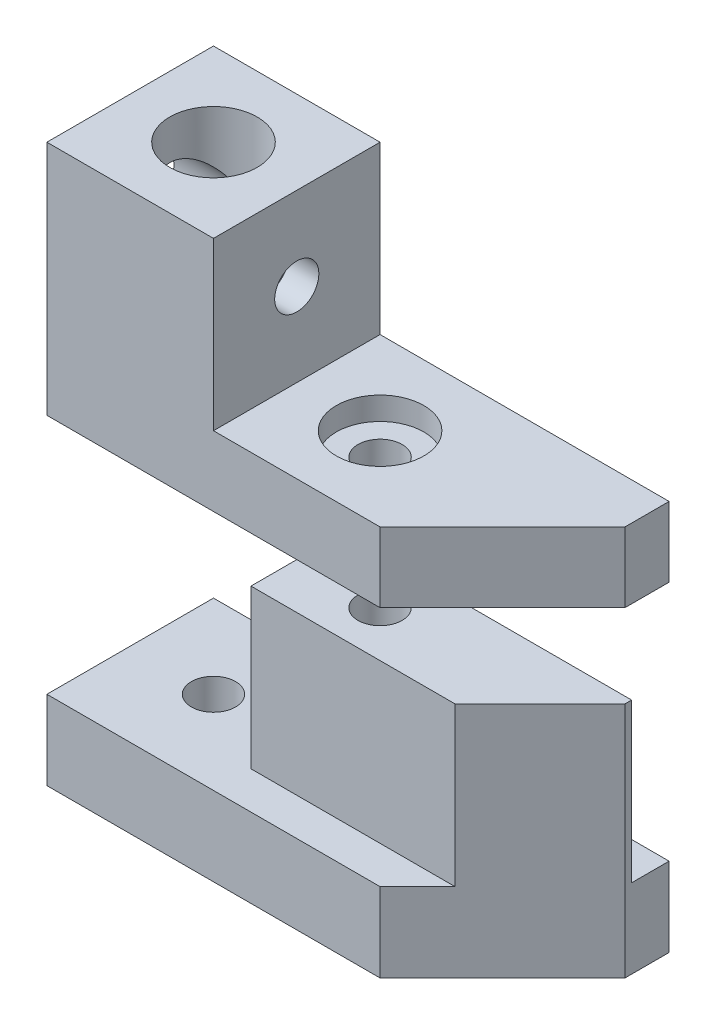
ISO-10303-21;
HEADER;
FILE_DESCRIPTION(('STEP AP214'),'2;1');
FILE_NAME('part.step','',(''),(''),'','','');
FILE_SCHEMA(('AUTOMOTIVE_DESIGN { 1 0 10303 214 1 1 1 1 }'));
ENDSEC;
DATA;
#1=APPLICATION_CONTEXT('core data for automotive mechanical design processes');
#2=APPLICATION_PROTOCOL_DEFINITION('international standard','automotive_design',2000,#1);
#3=PRODUCT_CONTEXT('',#1,'mechanical');
#4=PRODUCT('Part','Part','',(#3));
#5=PRODUCT_RELATED_PRODUCT_CATEGORY('part','',(#4));
#6=PRODUCT_DEFINITION_FORMATION('','',#4);
#7=PRODUCT_DEFINITION_CONTEXT('part definition',#1,'design');
#8=PRODUCT_DEFINITION('design','',#6,#7);
#9=PRODUCT_DEFINITION_SHAPE('','',#8);
#10=(LENGTH_UNIT() NAMED_UNIT(*) SI_UNIT(.MILLI.,.METRE.));
#11=(NAMED_UNIT(*) PLANE_ANGLE_UNIT() SI_UNIT($,.RADIAN.));
#12=(NAMED_UNIT(*) SI_UNIT($,.STERADIAN.) SOLID_ANGLE_UNIT());
#13=UNCERTAINTY_MEASURE_WITH_UNIT(LENGTH_MEASURE(1.E-05),#10,'distance_accuracy_value','');
#14=(GEOMETRIC_REPRESENTATION_CONTEXT(3) GLOBAL_UNCERTAINTY_ASSIGNED_CONTEXT((#13)) GLOBAL_UNIT_ASSIGNED_CONTEXT((#10,
#11,#12)) REPRESENTATION_CONTEXT('',''));
#15=CARTESIAN_POINT('',(0.,0.,0.));
#16=DIRECTION('',(0.,0.,1.));
#17=DIRECTION('',(1.,0.,0.));
#18=AXIS2_PLACEMENT_3D('',#15,#16,#17);
#19=CARTESIAN_POINT('',(-40.,46.9,-40.));
#20=DIRECTION('',(0.,1.,0.));
#21=DIRECTION('',(-1.,0.,0.));
#22=AXIS2_PLACEMENT_3D('',#19,#20,#21);
#23=CYLINDRICAL_SURFACE('',#22,5.25);
#24=CARTESIAN_POINT('',(-40.,66.9,-40.));
#25=DIRECTION('',(0.,-1.,0.));
#26=DIRECTION('',(-1.,0.,0.));
#27=AXIS2_PLACEMENT_3D('',#24,#25,#26);
#28=CIRCLE('',#27,5.25);
#29=CARTESIAN_POINT('',(-45.25,66.9,-40.));
#30=VERTEX_POINT('',#29);
#31=EDGE_CURVE('E274',#30,#30,#28,.T.);
#32=ORIENTED_EDGE('',*,*,#31,.F.);
#33=EDGE_LOOP('',(#32));
#34=FACE_BOUND('',#33,.T.);
#35=CARTESIAN_POINT('',(-40.,56.9,-40.));
#36=DIRECTION('',(-0.707106781186547,-0.707106781186547,0.));
#37=DIRECTION('',(-0.707106781186547,0.707106781186547,0.));
#38=AXIS2_PLACEMENT_3D('',#35,#36,#37);
#39=ELLIPSE('',#38,7.42462120245875,5.25);
#40=CARTESIAN_POINT('',(-40.,56.9,-45.25));
#41=VERTEX_POINT('',#40);
#42=CARTESIAN_POINT('',(-40.,56.9,-34.75));
#43=VERTEX_POINT('',#42);
#44=EDGE_CURVE('E12',#41,#43,#39,.F.);
#45=ORIENTED_EDGE('',*,*,#44,.F.);
#46=CARTESIAN_POINT('',(-40.,56.9,-40.));
#47=DIRECTION('',(0.707106781186547,-0.707106781186547,0.));
#48=DIRECTION('',(0.707106781186547,0.707106781186547,0.));
#49=AXIS2_PLACEMENT_3D('',#46,#47,#48);
#50=ELLIPSE('',#49,7.42462120245875,5.25);
#51=EDGE_CURVE('E68',#43,#41,#50,.F.);
#52=ORIENTED_EDGE('',*,*,#51,.F.);
#53=EDGE_LOOP('',(#45,#52));
#54=FACE_BOUND('',#53,.T.);
#55=ADVANCED_FACE('F59',(#34,#54),#23,.F.);
#56=CARTESIAN_POINT('',(-10.,46.9,-30.));
#57=DIRECTION('',(0.,0.,-1.));
#58=DIRECTION('',(1.,0.,0.));
#59=AXIS2_PLACEMENT_3D('',#56,#57,#58);
#60=PLANE('',#59);
#61=DIRECTION('',(-1.,0.,0.));
#62=VECTOR('',#61,1.);
#63=CARTESIAN_POINT('',(-10.,38.5,-30.));
#64=LINE('',#63,#62);
#65=CARTESIAN_POINT('',(-10.,38.5,-30.));
#66=VERTEX_POINT('',#65);
#67=CARTESIAN_POINT('',(-50.,38.5,-30.));
#68=VERTEX_POINT('',#67);
#69=EDGE_CURVE('E216',#66,#68,#64,.T.);
#70=ORIENTED_EDGE('',*,*,#69,.F.);
#71=DIRECTION('',(0.,-1.,0.));
#72=VECTOR('',#71,1.);
#73=CARTESIAN_POINT('',(-10.,46.9,-30.));
#74=LINE('',#73,#72);
#75=CARTESIAN_POINT('',(-10.,46.9,-30.));
#76=VERTEX_POINT('',#75);
#77=EDGE_CURVE('E241',#76,#66,#74,.T.);
#78=ORIENTED_EDGE('',*,*,#77,.F.);
#79=DIRECTION('',(-1.,0.,0.));
#80=VECTOR('',#79,1.);
#81=CARTESIAN_POINT('',(-10.,46.9,-30.));
#82=LINE('',#81,#80);
#83=CARTESIAN_POINT('',(-30.,46.9,-30.));
#84=VERTEX_POINT('',#83);
#85=EDGE_CURVE('E240',#76,#84,#82,.T.);
#86=ORIENTED_EDGE('',*,*,#85,.T.);
#87=DIRECTION('',(0.,-1.,0.));
#88=VECTOR('',#87,1.);
#89=CARTESIAN_POINT('',(-30.,66.9,-30.));
#90=LINE('',#89,#88);
#91=CARTESIAN_POINT('',(-30.,66.9,-30.));
#92=VERTEX_POINT('',#91);
#93=EDGE_CURVE('E230',#92,#84,#90,.T.);
#94=ORIENTED_EDGE('',*,*,#93,.F.);
#95=DIRECTION('',(-1.,0.,0.));
#96=VECTOR('',#95,1.);
#97=CARTESIAN_POINT('',(-30.,66.9,-30.));
#98=LINE('',#97,#96);
#99=CARTESIAN_POINT('',(-50.,66.9,-30.));
#100=VERTEX_POINT('',#99);
#101=EDGE_CURVE('E222',#92,#100,#98,.T.);
#102=ORIENTED_EDGE('',*,*,#101,.T.);
#103=DIRECTION('',(0.,-1.,0.));
#104=VECTOR('',#103,1.);
#105=CARTESIAN_POINT('',(-50.,46.9,-30.));
#106=LINE('',#105,#104);
#107=EDGE_CURVE('E131',#100,#68,#106,.T.);
#108=ORIENTED_EDGE('',*,*,#107,.T.);
#109=EDGE_LOOP('',(#70,#78,#86,#94,#102,#108));
#110=FACE_BOUND('',#109,.T.);
#111=ADVANCED_FACE('F61',(#110),#60,.F.);
#112=CARTESIAN_POINT('',(-50.,46.9,-30.));
#113=DIRECTION('',(1.,0.,0.));
#114=DIRECTION('',(0.,0.,1.));
#115=AXIS2_PLACEMENT_3D('',#112,#113,#114);
#116=PLANE('',#115);
#117=CARTESIAN_POINT('',(-50.,56.9,-40.));
#118=DIRECTION('',(1.,0.,0.));
#119=DIRECTION('',(0.,0.,-1.));
#120=AXIS2_PLACEMENT_3D('',#117,#118,#119);
#121=CIRCLE('',#120,5.25);
#122=CARTESIAN_POINT('',(-50.,56.9,-45.25));
#123=VERTEX_POINT('',#122);
#124=EDGE_CURVE('E202',#123,#123,#121,.T.);
#125=ORIENTED_EDGE('',*,*,#124,.T.);
#126=EDGE_LOOP('',(#125));
#127=FACE_BOUND('',#126,.T.);
#128=DIRECTION('',(0.,0.,-1.));
#129=VECTOR('',#128,1.);
#130=CARTESIAN_POINT('',(-50.,38.5,-30.));
#131=LINE('',#130,#129);
#132=CARTESIAN_POINT('',(-50.,38.5,-50.));
#133=VERTEX_POINT('',#132);
#134=EDGE_CURVE('E206',#68,#133,#131,.T.);
#135=ORIENTED_EDGE('',*,*,#134,.F.);
#136=ORIENTED_EDGE('',*,*,#107,.F.);
#137=DIRECTION('',(0.,0.,-1.));
#138=VECTOR('',#137,1.);
#139=CARTESIAN_POINT('',(-50.,66.9,-30.));
#140=LINE('',#139,#138);
#141=CARTESIAN_POINT('',(-50.,66.9,-50.));
#142=VERTEX_POINT('',#141);
#143=EDGE_CURVE('E277',#100,#142,#140,.T.);
#144=ORIENTED_EDGE('',*,*,#143,.T.);
#145=DIRECTION('',(0.,-1.,0.));
#146=VECTOR('',#145,1.);
#147=CARTESIAN_POINT('',(-50.,46.9,-50.));
#148=LINE('',#147,#146);
#149=EDGE_CURVE('E211',#142,#133,#148,.T.);
#150=ORIENTED_EDGE('',*,*,#149,.T.);
#151=EDGE_LOOP('',(#135,#136,#144,#150));
#152=FACE_BOUND('',#151,.T.);
#153=ADVANCED_FACE('F158',(#127,#152),#116,.F.);
#154=CARTESIAN_POINT('',(4.70000000000001,46.9,-50.));
#155=DIRECTION('',(0.,0.,1.));
#156=DIRECTION('',(-1.,0.,0.));
#157=AXIS2_PLACEMENT_3D('',#154,#155,#156);
#158=PLANE('',#157);
#159=DIRECTION('',(1.,0.,0.));
#160=VECTOR('',#159,1.);
#161=CARTESIAN_POINT('',(4.70000000000001,38.5,-50.));
#162=LINE('',#161,#160);
#163=CARTESIAN_POINT('',(4.70000000000001,38.5,-50.));
#164=VERTEX_POINT('',#163);
#165=EDGE_CURVE('E215',#133,#164,#162,.T.);
#166=ORIENTED_EDGE('',*,*,#165,.F.);
#167=ORIENTED_EDGE('',*,*,#149,.F.);
#168=DIRECTION('',(1.,0.,0.));
#169=VECTOR('',#168,1.);
#170=CARTESIAN_POINT('',(-30.,66.9,-50.));
#171=LINE('',#170,#169);
#172=CARTESIAN_POINT('',(-30.,66.9,-50.));
#173=VERTEX_POINT('',#172);
#174=EDGE_CURVE('E279',#142,#173,#171,.T.);
#175=ORIENTED_EDGE('',*,*,#174,.T.);
#176=DIRECTION('',(0.,-1.,0.));
#177=VECTOR('',#176,1.);
#178=CARTESIAN_POINT('',(-30.,66.9,-50.));
#179=LINE('',#178,#177);
#180=CARTESIAN_POINT('',(-30.,46.9,-50.));
#181=VERTEX_POINT('',#180);
#182=EDGE_CURVE('E227',#173,#181,#179,.T.);
#183=ORIENTED_EDGE('',*,*,#182,.T.);
#184=DIRECTION('',(1.,0.,0.));
#185=VECTOR('',#184,1.);
#186=CARTESIAN_POINT('',(-9.99999999999998,46.9,-50.));
#187=LINE('',#186,#185);
#188=CARTESIAN_POINT('',(4.70000000000001,46.9,-50.));
#189=VERTEX_POINT('',#188);
#190=EDGE_CURVE('E288',#181,#189,#187,.T.);
#191=ORIENTED_EDGE('',*,*,#190,.T.);
#192=DIRECTION('',(0.,-1.,0.));
#193=VECTOR('',#192,1.);
#194=CARTESIAN_POINT('',(4.70000000000001,46.9,-50.));
#195=LINE('',#194,#193);
#196=EDGE_CURVE('E246',#189,#164,#195,.T.);
#197=ORIENTED_EDGE('',*,*,#196,.T.);
#198=EDGE_LOOP('',(#166,#167,#175,#183,#191,#197));
#199=FACE_BOUND('',#198,.T.);
#200=ADVANCED_FACE('F192',(#199),#158,.F.);
#201=CARTESIAN_POINT('',(4.70000000000001,46.9,-44.7));
#202=DIRECTION('',(-1.,0.,0.));
#203=DIRECTION('',(0.,0.,-1.));
#204=AXIS2_PLACEMENT_3D('',#201,#202,#203);
#205=PLANE('',#204);
#206=DIRECTION('',(0.,0.,1.));
#207=VECTOR('',#206,1.);
#208=CARTESIAN_POINT('',(4.70000000000001,38.5,-44.7));
#209=LINE('',#208,#207);
#210=CARTESIAN_POINT('',(4.70000000000001,38.5,-44.7));
#211=VERTEX_POINT('',#210);
#212=EDGE_CURVE('E237',#164,#211,#209,.T.);
#213=ORIENTED_EDGE('',*,*,#212,.F.);
#214=ORIENTED_EDGE('',*,*,#196,.F.);
#215=DIRECTION('',(0.,0.,1.));
#216=VECTOR('',#215,1.);
#217=CARTESIAN_POINT('',(4.70000000000001,46.9,-44.7));
#218=LINE('',#217,#216);
#219=CARTESIAN_POINT('',(4.70000000000001,46.9,-44.7));
#220=VERTEX_POINT('',#219);
#221=EDGE_CURVE('E290',#189,#220,#218,.T.);
#222=ORIENTED_EDGE('',*,*,#221,.T.);
#223=DIRECTION('',(0.,-1.,0.));
#224=VECTOR('',#223,1.);
#225=CARTESIAN_POINT('',(4.70000000000001,46.9,-44.7));
#226=LINE('',#225,#224);
#227=EDGE_CURVE('E243',#220,#211,#226,.T.);
#228=ORIENTED_EDGE('',*,*,#227,.T.);
#229=EDGE_LOOP('',(#213,#214,#222,#228));
#230=FACE_BOUND('',#229,.T.);
#231=ADVANCED_FACE('F188',(#230),#205,.F.);
#232=CARTESIAN_POINT('',(-10.,46.9,-30.));
#233=DIRECTION('',(-0.707106781186547,0.,-0.707106781186548));
#234=DIRECTION('',(0.707106781186548,0.,-0.707106781186547));
#235=AXIS2_PLACEMENT_3D('',#232,#233,#234);
#236=PLANE('',#235);
#237=DIRECTION('',(-0.707106781186548,0.,0.707106781186547));
#238=VECTOR('',#237,1.);
#239=CARTESIAN_POINT('',(-10.,38.5,-30.));
#240=LINE('',#239,#238);
#241=EDGE_CURVE('E225',#211,#66,#240,.T.);
#242=ORIENTED_EDGE('',*,*,#241,.F.);
#243=ORIENTED_EDGE('',*,*,#227,.F.);
#244=DIRECTION('',(-0.707106781186548,0.,0.707106781186547));
#245=VECTOR('',#244,1.);
#246=CARTESIAN_POINT('',(-10.,46.9,-30.));
#247=LINE('',#246,#245);
#248=EDGE_CURVE('E233',#220,#76,#247,.T.);
#249=ORIENTED_EDGE('',*,*,#248,.T.);
#250=ORIENTED_EDGE('',*,*,#77,.T.);
#251=EDGE_LOOP('',(#242,#243,#249,#250));
#252=FACE_BOUND('',#251,.T.);
#253=ADVANCED_FACE('F181',(#252),#236,.F.);
#254=CARTESIAN_POINT('',(-40.,46.9,-40.));
#255=DIRECTION('',(0.,1.,0.));
#256=DIRECTION('',(-1.,0.,0.));
#257=AXIS2_PLACEMENT_3D('',#254,#255,#256);
#258=PLANE('',#257);
#259=CARTESIAN_POINT('',(-20.,46.9,-40.));
#260=DIRECTION('',(0.,-1.,0.));
#261=DIRECTION('',(-1.,0.,0.));
#262=AXIS2_PLACEMENT_3D('',#259,#260,#261);
#263=CIRCLE('',#262,5.24999999999999);
#264=CARTESIAN_POINT('',(-25.25,46.9,-40.));
#265=VERTEX_POINT('',#264);
#266=EDGE_CURVE('E267',#265,#265,#263,.T.);
#267=ORIENTED_EDGE('',*,*,#266,.T.);
#268=EDGE_LOOP('',(#267));
#269=FACE_BOUND('',#268,.T.);
#270=DIRECTION('',(0.,0.,1.));
#271=VECTOR('',#270,1.);
#272=CARTESIAN_POINT('',(-30.,46.9,-30.));
#273=LINE('',#272,#271);
#274=EDGE_CURVE('E83',#181,#84,#273,.T.);
#275=ORIENTED_EDGE('',*,*,#274,.T.);
#276=ORIENTED_EDGE('',*,*,#85,.F.);
#277=ORIENTED_EDGE('',*,*,#248,.F.);
#278=ORIENTED_EDGE('',*,*,#221,.F.);
#279=ORIENTED_EDGE('',*,*,#190,.F.);
#280=EDGE_LOOP('',(#275,#276,#277,#278,#279));
#281=FACE_BOUND('',#280,.T.);
#282=ADVANCED_FACE('F178',(#269,#281),#258,.T.);
#283=CARTESIAN_POINT('',(-40.,38.5,-40.));
#284=DIRECTION('',(0.,1.,0.));
#285=DIRECTION('',(-1.,0.,0.));
#286=AXIS2_PLACEMENT_3D('',#283,#284,#285);
#287=PLANE('',#286);
#288=CARTESIAN_POINT('',(-20.,38.5,-40.));
#289=DIRECTION('',(0.,-1.,0.));
#290=DIRECTION('',(-1.,0.,0.));
#291=AXIS2_PLACEMENT_3D('',#288,#289,#290);
#292=CIRCLE('',#291,2.65);
#293=CARTESIAN_POINT('',(-22.65,38.5,-40.));
#294=VERTEX_POINT('',#293);
#295=EDGE_CURVE('E253',#294,#294,#292,.T.);
#296=ORIENTED_EDGE('',*,*,#295,.F.);
#297=EDGE_LOOP('',(#296));
#298=FACE_BOUND('',#297,.T.);
#299=CARTESIAN_POINT('',(-40.,38.5,-40.));
#300=DIRECTION('',(0.,-1.,0.));
#301=DIRECTION('',(-1.,0.,0.));
#302=AXIS2_PLACEMENT_3D('',#299,#300,#301);
#303=CIRCLE('',#302,2.65);
#304=CARTESIAN_POINT('',(-42.65,38.5,-40.));
#305=VERTEX_POINT('',#304);
#306=EDGE_CURVE('E250',#305,#305,#303,.T.);
#307=ORIENTED_EDGE('',*,*,#306,.F.);
#308=EDGE_LOOP('',(#307));
#309=FACE_BOUND('',#308,.T.);
#310=ORIENTED_EDGE('',*,*,#69,.T.);
#311=ORIENTED_EDGE('',*,*,#134,.T.);
#312=ORIENTED_EDGE('',*,*,#165,.T.);
#313=ORIENTED_EDGE('',*,*,#212,.T.);
#314=ORIENTED_EDGE('',*,*,#241,.T.);
#315=EDGE_LOOP('',(#310,#311,#312,#313,#314));
#316=FACE_BOUND('',#315,.T.);
#317=ADVANCED_FACE('F172',(#298,#309,#316),#287,.F.);
#318=CARTESIAN_POINT('',(-30.,66.9,-30.));
#319=DIRECTION('',(-1.,0.,0.));
#320=DIRECTION('',(0.,0.,-1.));
#321=AXIS2_PLACEMENT_3D('',#318,#319,#320);
#322=PLANE('',#321);
#323=CARTESIAN_POINT('',(-30.,56.9,-40.));
#324=DIRECTION('',(1.,0.,0.));
#325=DIRECTION('',(0.,0.,-1.));
#326=AXIS2_PLACEMENT_3D('',#323,#324,#325);
#327=CIRCLE('',#326,2.65);
#328=CARTESIAN_POINT('',(-30.,56.9,-42.65));
#329=VERTEX_POINT('',#328);
#330=EDGE_CURVE('E63',#329,#329,#327,.T.);
#331=ORIENTED_EDGE('',*,*,#330,.F.);
#332=EDGE_LOOP('',(#331));
#333=FACE_BOUND('',#332,.T.);
#334=ORIENTED_EDGE('',*,*,#274,.F.);
#335=ORIENTED_EDGE('',*,*,#182,.F.);
#336=DIRECTION('',(0.,0.,1.));
#337=VECTOR('',#336,1.);
#338=CARTESIAN_POINT('',(-30.,66.9,-30.));
#339=LINE('',#338,#337);
#340=EDGE_CURVE('E282',#173,#92,#339,.T.);
#341=ORIENTED_EDGE('',*,*,#340,.T.);
#342=ORIENTED_EDGE('',*,*,#93,.T.);
#343=EDGE_LOOP('',(#334,#335,#341,#342));
#344=FACE_BOUND('',#343,.T.);
#345=ADVANCED_FACE('F167',(#333,#344),#322,.F.);
#346=CARTESIAN_POINT('',(-40.,66.9,-40.));
#347=DIRECTION('',(0.,1.,0.));
#348=DIRECTION('',(-1.,0.,0.));
#349=AXIS2_PLACEMENT_3D('',#346,#347,#348);
#350=PLANE('',#349);
#351=ORIENTED_EDGE('',*,*,#31,.T.);
#352=EDGE_LOOP('',(#351));
#353=FACE_BOUND('',#352,.T.);
#354=ORIENTED_EDGE('',*,*,#101,.F.);
#355=ORIENTED_EDGE('',*,*,#340,.F.);
#356=ORIENTED_EDGE('',*,*,#174,.F.);
#357=ORIENTED_EDGE('',*,*,#143,.F.);
#358=EDGE_LOOP('',(#354,#355,#356,#357));
#359=FACE_BOUND('',#358,.T.);
#360=ADVANCED_FACE('F163',(#353,#359),#350,.T.);
#361=CARTESIAN_POINT('',(-40.,56.9,-40.));
#362=DIRECTION('',(0.707106781186547,-0.707106781186547,0.));
#363=DIRECTION('',(0.707106781186547,0.707106781186547,0.));
#364=AXIS2_PLACEMENT_3D('',#361,#362,#363);
#365=ELLIPSE('',#364,7.42462120245875,5.25);
#366=EDGE_CURVE('E130',#43,#41,#365,.T.);
#367=ORIENTED_EDGE('',*,*,#366,.F.);
#368=CARTESIAN_POINT('',(-40.,56.9,-40.));
#369=DIRECTION('',(-0.707106781186547,-0.707106781186547,0.));
#370=DIRECTION('',(-0.707106781186547,0.707106781186547,0.));
#371=AXIS2_PLACEMENT_3D('',#368,#369,#370);
#372=ELLIPSE('',#371,7.42462120245875,5.25);
#373=EDGE_CURVE('E75',#41,#43,#372,.T.);
#374=ORIENTED_EDGE('',*,*,#373,.F.);
#375=EDGE_LOOP('',(#367,#374));
#376=FACE_BOUND('',#375,.T.);
#377=CARTESIAN_POINT('',(-40.,44.15,-40.));
#378=DIRECTION('',(0.,-1.,0.));
#379=DIRECTION('',(-1.,0.,0.));
#380=AXIS2_PLACEMENT_3D('',#377,#378,#379);
#381=CIRCLE('',#380,5.24999999999999);
#382=CARTESIAN_POINT('',(-45.25,44.15,-40.));
#383=VERTEX_POINT('',#382);
#384=EDGE_CURVE('E255',#383,#383,#381,.T.);
#385=ORIENTED_EDGE('',*,*,#384,.T.);
#386=EDGE_LOOP('',(#385));
#387=FACE_BOUND('',#386,.T.);
#388=ADVANCED_FACE('F133',(#376,#387),#23,.F.);
#389=CARTESIAN_POINT('',(-36.4,56.9,-40.));
#390=DIRECTION('',(-1.,0.,0.));
#391=DIRECTION('',(0.,0.,-1.));
#392=AXIS2_PLACEMENT_3D('',#389,#390,#391);
#393=CYLINDRICAL_SURFACE('',#392,5.25);
#394=ORIENTED_EDGE('',*,*,#373,.T.);
#395=ORIENTED_EDGE('',*,*,#51,.T.);
#396=EDGE_LOOP('',(#394,#395));
#397=FACE_BOUND('',#396,.T.);
#398=CARTESIAN_POINT('',(-33.65,56.9,-40.));
#399=DIRECTION('',(1.,0.,0.));
#400=DIRECTION('',(0.,0.,-1.));
#401=AXIS2_PLACEMENT_3D('',#398,#399,#400);
#402=CIRCLE('',#401,5.24999999999999);
#403=CARTESIAN_POINT('',(-33.65,56.9,-45.25));
#404=VERTEX_POINT('',#403);
#405=EDGE_CURVE('E334',#404,#404,#402,.T.);
#406=ORIENTED_EDGE('',*,*,#405,.T.);
#407=EDGE_LOOP('',(#406));
#408=FACE_BOUND('',#407,.T.);
#409=ADVANCED_FACE('F126',(#397,#408),#393,.F.);
#410=ORIENTED_EDGE('',*,*,#124,.F.);
#411=EDGE_LOOP('',(#410));
#412=FACE_BOUND('',#411,.T.);
#413=ORIENTED_EDGE('',*,*,#44,.T.);
#414=ORIENTED_EDGE('',*,*,#366,.T.);
#415=EDGE_LOOP('',(#413,#414));
#416=FACE_BOUND('',#415,.T.);
#417=ADVANCED_FACE('F139',(#412,#416),#393,.F.);
#418=CARTESIAN_POINT('',(-40.,46.9,-40.));
#419=DIRECTION('',(0.,1.,0.));
#420=DIRECTION('',(-1.,0.,0.));
#421=AXIS2_PLACEMENT_3D('',#418,#419,#420);
#422=CYLINDRICAL_SURFACE('',#421,2.65);
#423=CARTESIAN_POINT('',(-40.,44.15,-40.));
#424=DIRECTION('',(0.,-1.,0.));
#425=DIRECTION('',(-1.,0.,0.));
#426=AXIS2_PLACEMENT_3D('',#423,#424,#425);
#427=CIRCLE('',#426,2.65000000000001);
#428=CARTESIAN_POINT('',(-42.65,44.15,-40.));
#429=VERTEX_POINT('',#428);
#430=EDGE_CURVE('E252',#429,#429,#427,.T.);
#431=ORIENTED_EDGE('',*,*,#430,.F.);
#432=EDGE_LOOP('',(#431));
#433=FACE_BOUND('',#432,.T.);
#434=ORIENTED_EDGE('',*,*,#306,.T.);
#435=EDGE_LOOP('',(#434));
#436=FACE_BOUND('',#435,.T.);
#437=ADVANCED_FACE('F141',(#433,#436),#422,.F.);
#438=CARTESIAN_POINT('',(-40.,44.15,-42.65));
#439=DIRECTION('',(0.,-1.,0.));
#440=DIRECTION('',(1.,0.,0.));
#441=AXIS2_PLACEMENT_3D('',#438,#439,#440);
#442=PLANE('',#441);
#443=ORIENTED_EDGE('',*,*,#430,.T.);
#444=EDGE_LOOP('',(#443));
#445=FACE_BOUND('',#444,.T.);
#446=ORIENTED_EDGE('',*,*,#384,.F.);
#447=EDGE_LOOP('',(#446));
#448=FACE_BOUND('',#447,.T.);
#449=ADVANCED_FACE('F148',(#445,#448),#442,.F.);
#450=CARTESIAN_POINT('',(-20.,46.9,-40.));
#451=DIRECTION('',(0.,1.,0.));
#452=DIRECTION('',(-1.,0.,0.));
#453=AXIS2_PLACEMENT_3D('',#450,#451,#452);
#454=CYLINDRICAL_SURFACE('',#453,2.65);
#455=CARTESIAN_POINT('',(-20.,44.15,-40.));
#456=DIRECTION('',(0.,-1.,0.));
#457=DIRECTION('',(-1.,0.,0.));
#458=AXIS2_PLACEMENT_3D('',#455,#456,#457);
#459=CIRCLE('',#458,2.65000000000001);
#460=CARTESIAN_POINT('',(-22.65,44.15,-40.));
#461=VERTEX_POINT('',#460);
#462=EDGE_CURVE('E256',#461,#461,#459,.T.);
#463=ORIENTED_EDGE('',*,*,#462,.F.);
#464=EDGE_LOOP('',(#463));
#465=FACE_BOUND('',#464,.T.);
#466=ORIENTED_EDGE('',*,*,#295,.T.);
#467=EDGE_LOOP('',(#466));
#468=FACE_BOUND('',#467,.T.);
#469=ADVANCED_FACE('F303',(#465,#468),#454,.F.);
#470=CARTESIAN_POINT('',(-20.,44.15,-42.65));
#471=DIRECTION('',(0.,-1.,0.));
#472=DIRECTION('',(1.,0.,0.));
#473=AXIS2_PLACEMENT_3D('',#470,#471,#472);
#474=PLANE('',#473);
#475=ORIENTED_EDGE('',*,*,#462,.T.);
#476=EDGE_LOOP('',(#475));
#477=FACE_BOUND('',#476,.T.);
#478=CARTESIAN_POINT('',(-20.,44.15,-40.));
#479=DIRECTION('',(0.,-1.,0.));
#480=DIRECTION('',(-1.,0.,0.));
#481=AXIS2_PLACEMENT_3D('',#478,#479,#480);
#482=CIRCLE('',#481,5.24999999999999);
#483=CARTESIAN_POINT('',(-25.25,44.15,-40.));
#484=VERTEX_POINT('',#483);
#485=EDGE_CURVE('E262',#484,#484,#482,.T.);
#486=ORIENTED_EDGE('',*,*,#485,.F.);
#487=EDGE_LOOP('',(#486));
#488=FACE_BOUND('',#487,.T.);
#489=ADVANCED_FACE('F309',(#477,#488),#474,.F.);
#490=CARTESIAN_POINT('',(-20.,46.9,-40.));
#491=DIRECTION('',(0.,1.,0.));
#492=DIRECTION('',(-1.,0.,0.));
#493=AXIS2_PLACEMENT_3D('',#490,#491,#492);
#494=CYLINDRICAL_SURFACE('',#493,5.24999999999999);
#495=ORIENTED_EDGE('',*,*,#485,.T.);
#496=EDGE_LOOP('',(#495));
#497=FACE_BOUND('',#496,.T.);
#498=ORIENTED_EDGE('',*,*,#266,.F.);
#499=EDGE_LOOP('',(#498));
#500=FACE_BOUND('',#499,.T.);
#501=ADVANCED_FACE('F315',(#497,#500),#494,.F.);
#502=CARTESIAN_POINT('',(-36.4,56.9,-40.));
#503=DIRECTION('',(-1.,0.,0.));
#504=DIRECTION('',(0.,0.,-1.));
#505=AXIS2_PLACEMENT_3D('',#502,#503,#504);
#506=CYLINDRICAL_SURFACE('',#505,2.65);
#507=CARTESIAN_POINT('',(-33.65,56.9,-40.));
#508=DIRECTION('',(1.,0.,0.));
#509=DIRECTION('',(0.,0.,-1.));
#510=AXIS2_PLACEMENT_3D('',#507,#508,#509);
#511=CIRCLE('',#510,2.65000000000001);
#512=CARTESIAN_POINT('',(-33.65,56.9,-42.65));
#513=VERTEX_POINT('',#512);
#514=EDGE_CURVE('E331',#513,#513,#511,.T.);
#515=ORIENTED_EDGE('',*,*,#514,.F.);
#516=EDGE_LOOP('',(#515));
#517=FACE_BOUND('',#516,.T.);
#518=ORIENTED_EDGE('',*,*,#330,.T.);
#519=EDGE_LOOP('',(#518));
#520=FACE_BOUND('',#519,.T.);
#521=ADVANCED_FACE('F318',(#517,#520),#506,.F.);
#522=CARTESIAN_POINT('',(-33.65,56.9,-42.65));
#523=DIRECTION('',(1.,0.,0.));
#524=DIRECTION('',(0.,0.,1.));
#525=AXIS2_PLACEMENT_3D('',#522,#523,#524);
#526=PLANE('',#525);
#527=ORIENTED_EDGE('',*,*,#514,.T.);
#528=EDGE_LOOP('',(#527));
#529=FACE_BOUND('',#528,.T.);
#530=ORIENTED_EDGE('',*,*,#405,.F.);
#531=EDGE_LOOP('',(#530));
#532=FACE_BOUND('',#531,.T.);
#533=ADVANCED_FACE('F322',(#529,#532),#526,.F.);
#534=CLOSED_SHELL('',(#55,#111,#153,#200,#231,#253,#282,#317,#345,#360,#388,#409,#417,#437,#449,
#469,#489,#501,#521,#533));
#535=MANIFOLD_SOLID_BREP('B2',#534);
#536=CARTESIAN_POINT('',(4.70000000000001,9.5,-50.));
#537=DIRECTION('',(0.,0.,1.));
#538=DIRECTION('',(-1.,0.,0.));
#539=AXIS2_PLACEMENT_3D('',#536,#537,#538);
#540=PLANE('',#539);
#541=DIRECTION('',(1.,0.,0.));
#542=VECTOR('',#541,1.);
#543=CARTESIAN_POINT('',(4.70000000000001,0.,-50.));
#544=LINE('',#543,#542);
#545=CARTESIAN_POINT('',(-50.,0.,-50.));
#546=VERTEX_POINT('',#545);
#547=CARTESIAN_POINT('',(4.70000000000001,0.,-50.));
#548=VERTEX_POINT('',#547);
#549=EDGE_CURVE('E640',#546,#548,#544,.T.);
#550=ORIENTED_EDGE('',*,*,#549,.F.);
#551=DIRECTION('',(0.,-1.,0.));
#552=VECTOR('',#551,1.);
#553=CARTESIAN_POINT('',(-50.,9.5,-50.));
#554=LINE('',#553,#552);
#555=CARTESIAN_POINT('',(-50.,9.5,-50.));
#556=VERTEX_POINT('',#555);
#557=EDGE_CURVE('E682',#556,#546,#554,.T.);
#558=ORIENTED_EDGE('',*,*,#557,.F.);
#559=DIRECTION('',(1.,0.,0.));
#560=VECTOR('',#559,1.);
#561=CARTESIAN_POINT('',(-50.,9.5,-50.));
#562=LINE('',#561,#560);
#563=CARTESIAN_POINT('',(4.70000000000001,9.5,-50.));
#564=VERTEX_POINT('',#563);
#565=EDGE_CURVE('E667',#556,#564,#562,.T.);
#566=ORIENTED_EDGE('',*,*,#565,.T.);
#567=DIRECTION('',(0.,-1.,0.));
#568=VECTOR('',#567,1.);
#569=CARTESIAN_POINT('',(4.70000000000001,9.5,-50.));
#570=LINE('',#569,#568);
#571=EDGE_CURVE('E57',#564,#548,#570,.T.);
#572=ORIENTED_EDGE('',*,*,#571,.T.);
#573=EDGE_LOOP('',(#550,#558,#566,#572));
#574=FACE_BOUND('',#573,.T.);
#575=ADVANCED_FACE('F558',(#574),#540,.F.);
#576=CARTESIAN_POINT('',(4.70000000000001,9.5,-50.));
#577=DIRECTION('',(-1.,0.,0.));
#578=DIRECTION('',(0.,0.,-1.));
#579=AXIS2_PLACEMENT_3D('',#576,#577,#578);
#580=PLANE('',#579);
#581=DIRECTION('',(0.,0.,1.));
#582=VECTOR('',#581,1.);
#583=CARTESIAN_POINT('',(4.70000000000001,0.,-50.));
#584=LINE('',#583,#582);
#585=CARTESIAN_POINT('',(4.70000000000001,0.,-44.7));
#586=VERTEX_POINT('',#585);
#587=EDGE_CURVE('E685',#548,#586,#584,.T.);
#588=ORIENTED_EDGE('',*,*,#587,.F.);
#589=ORIENTED_EDGE('',*,*,#571,.F.);
#590=DIRECTION('',(0.,0.,1.));
#591=VECTOR('',#590,1.);
#592=CARTESIAN_POINT('',(4.70000000000001,9.5,-50.));
#593=LINE('',#592,#591);
#594=CARTESIAN_POINT('',(4.70000000000001,9.5,-45.5));
#595=VERTEX_POINT('',#594);
#596=EDGE_CURVE('E670',#564,#595,#593,.T.);
#597=ORIENTED_EDGE('',*,*,#596,.T.);
#598=DIRECTION('',(0.,-1.,0.));
#599=VECTOR('',#598,1.);
#600=CARTESIAN_POINT('',(4.70000000000001,28.5,-45.5));
#601=LINE('',#600,#599);
#602=CARTESIAN_POINT('',(4.70000000000001,28.5,-45.5));
#603=VERTEX_POINT('',#602);
#604=EDGE_CURVE('E663',#603,#595,#601,.T.);
#605=ORIENTED_EDGE('',*,*,#604,.F.);
#606=DIRECTION('',(0.,0.,1.));
#607=VECTOR('',#606,1.);
#608=CARTESIAN_POINT('',(4.70000000000001,28.5,-44.7));
#609=LINE('',#608,#607);
#610=CARTESIAN_POINT('',(4.70000000000001,28.5,-44.7));
#611=VERTEX_POINT('',#610);
#612=EDGE_CURVE('E655',#603,#611,#609,.T.);
#613=ORIENTED_EDGE('',*,*,#612,.T.);
#614=DIRECTION('',(0.,-1.,0.));
#615=VECTOR('',#614,1.);
#616=CARTESIAN_POINT('',(4.70000000000001,9.5,-44.7));
#617=LINE('',#616,#615);
#618=EDGE_CURVE('E566',#611,#586,#617,.T.);
#619=ORIENTED_EDGE('',*,*,#618,.T.);
#620=EDGE_LOOP('',(#588,#589,#597,#605,#613,#619));
#621=FACE_BOUND('',#620,.T.);
#622=ADVANCED_FACE('F706',(#621),#580,.F.);
#623=CARTESIAN_POINT('',(-10.,9.5,-30.));
#624=DIRECTION('',(-0.707106781186547,0.,-0.707106781186548));
#625=DIRECTION('',(0.707106781186548,0.,-0.707106781186547));
#626=AXIS2_PLACEMENT_3D('',#623,#624,#625);
#627=PLANE('',#626);
#628=DIRECTION('',(-0.707106781186548,0.,0.707106781186547));
#629=VECTOR('',#628,1.);
#630=CARTESIAN_POINT('',(-10.,0.,-30.));
#631=LINE('',#630,#629);
#632=CARTESIAN_POINT('',(-10.,0.,-30.));
#633=VERTEX_POINT('',#632);
#634=EDGE_CURVE('E688',#586,#633,#631,.T.);
#635=ORIENTED_EDGE('',*,*,#634,.F.);
#636=ORIENTED_EDGE('',*,*,#618,.F.);
#637=DIRECTION('',(-0.707106781186548,0.,0.707106781186547));
#638=VECTOR('',#637,1.);
#639=CARTESIAN_POINT('',(-5.50000000000001,28.5,-34.5));
#640=LINE('',#639,#638);
#641=CARTESIAN_POINT('',(-5.50000000000001,28.5,-34.5));
#642=VERTEX_POINT('',#641);
#643=EDGE_CURVE('E658',#611,#642,#640,.T.);
#644=ORIENTED_EDGE('',*,*,#643,.T.);
#645=DIRECTION('',(0.,-1.,0.));
#646=VECTOR('',#645,1.);
#647=CARTESIAN_POINT('',(-5.50000000000001,28.5,-34.5));
#648=LINE('',#647,#646);
#649=CARTESIAN_POINT('',(-5.50000000000001,9.5,-34.5));
#650=VERTEX_POINT('',#649);
#651=EDGE_CURVE('E645',#642,#650,#648,.T.);
#652=ORIENTED_EDGE('',*,*,#651,.T.);
#653=DIRECTION('',(-0.707106781186548,0.,0.707106781186547));
#654=VECTOR('',#653,1.);
#655=CARTESIAN_POINT('',(-10.,9.5,-30.));
#656=LINE('',#655,#654);
#657=CARTESIAN_POINT('',(-10.,9.5,-30.));
#658=VERTEX_POINT('',#657);
#659=EDGE_CURVE('E674',#650,#658,#656,.T.);
#660=ORIENTED_EDGE('',*,*,#659,.T.);
#661=DIRECTION('',(0.,-1.,0.));
#662=VECTOR('',#661,1.);
#663=CARTESIAN_POINT('',(-10.,9.5,-30.));
#664=LINE('',#663,#662);
#665=EDGE_CURVE('E700',#658,#633,#664,.T.);
#666=ORIENTED_EDGE('',*,*,#665,.T.);
#667=EDGE_LOOP('',(#635,#636,#644,#652,#660,#666));
#668=FACE_BOUND('',#667,.T.);
#669=ADVANCED_FACE('F721',(#668),#627,.F.);
#670=CARTESIAN_POINT('',(-50.,9.5,-30.));
#671=DIRECTION('',(0.,0.,-1.));
#672=DIRECTION('',(1.,0.,0.));
#673=AXIS2_PLACEMENT_3D('',#670,#671,#672);
#674=PLANE('',#673);
#675=DIRECTION('',(-1.,0.,0.));
#676=VECTOR('',#675,1.);
#677=CARTESIAN_POINT('',(-50.,0.,-30.));
#678=LINE('',#677,#676);
#679=CARTESIAN_POINT('',(-50.,0.,-30.));
#680=VERTEX_POINT('',#679);
#681=EDGE_CURVE('E691',#633,#680,#678,.T.);
#682=ORIENTED_EDGE('',*,*,#681,.F.);
#683=ORIENTED_EDGE('',*,*,#665,.F.);
#684=DIRECTION('',(-1.,0.,0.));
#685=VECTOR('',#684,1.);
#686=CARTESIAN_POINT('',(-50.,9.5,-30.));
#687=LINE('',#686,#685);
#688=CARTESIAN_POINT('',(-50.,9.5,-30.));
#689=VERTEX_POINT('',#688);
#690=EDGE_CURVE('E677',#658,#689,#687,.T.);
#691=ORIENTED_EDGE('',*,*,#690,.T.);
#692=DIRECTION('',(0.,-1.,0.));
#693=VECTOR('',#692,1.);
#694=CARTESIAN_POINT('',(-50.,9.5,-30.));
#695=LINE('',#694,#693);
#696=EDGE_CURVE('E697',#689,#680,#695,.T.);
#697=ORIENTED_EDGE('',*,*,#696,.T.);
#698=EDGE_LOOP('',(#682,#683,#691,#697));
#699=FACE_BOUND('',#698,.T.);
#700=ADVANCED_FACE('F725',(#699),#674,.F.);
#701=CARTESIAN_POINT('',(-50.,9.5,-50.));
#702=DIRECTION('',(1.,0.,0.));
#703=DIRECTION('',(0.,0.,1.));
#704=AXIS2_PLACEMENT_3D('',#701,#702,#703);
#705=PLANE('',#704);
#706=DIRECTION('',(0.,0.,-1.));
#707=VECTOR('',#706,1.);
#708=CARTESIAN_POINT('',(-50.,0.,-50.));
#709=LINE('',#708,#707);
#710=EDGE_CURVE('E671',#680,#546,#709,.T.);
#711=ORIENTED_EDGE('',*,*,#710,.F.);
#712=ORIENTED_EDGE('',*,*,#696,.F.);
#713=DIRECTION('',(0.,0.,-1.));
#714=VECTOR('',#713,1.);
#715=CARTESIAN_POINT('',(-50.,9.5,-50.));
#716=LINE('',#715,#714);
#717=EDGE_CURVE('E680',#689,#556,#716,.T.);
#718=ORIENTED_EDGE('',*,*,#717,.T.);
#719=ORIENTED_EDGE('',*,*,#557,.T.);
#720=EDGE_LOOP('',(#711,#712,#718,#719));
#721=FACE_BOUND('',#720,.T.);
#722=ADVANCED_FACE('F727',(#721),#705,.F.);
#723=CARTESIAN_POINT('',(-40.,9.5,-40.));
#724=DIRECTION('',(0.,1.,0.));
#725=DIRECTION('',(-1.,0.,0.));
#726=AXIS2_PLACEMENT_3D('',#723,#724,#725);
#727=PLANE('',#726);
#728=CARTESIAN_POINT('',(-40.,9.5,-40.));
#729=DIRECTION('',(0.,-1.,0.));
#730=DIRECTION('',(-1.,0.,0.));
#731=AXIS2_PLACEMENT_3D('',#728,#729,#730);
#732=CIRCLE('',#731,2.65);
#733=CARTESIAN_POINT('',(-42.65,9.5,-40.));
#734=VERTEX_POINT('',#733);
#735=EDGE_CURVE('E651',#734,#734,#732,.T.);
#736=ORIENTED_EDGE('',*,*,#735,.T.);
#737=EDGE_LOOP('',(#736));
#738=FACE_BOUND('',#737,.T.);
#739=DIRECTION('',(-1.,0.,0.));
#740=VECTOR('',#739,1.);
#741=CARTESIAN_POINT('',(-9.99999999999999,9.5,-34.5));
#742=LINE('',#741,#740);
#743=CARTESIAN_POINT('',(-30.,9.5,-34.5));
#744=VERTEX_POINT('',#743);
#745=EDGE_CURVE('E578',#650,#744,#742,.T.);
#746=ORIENTED_EDGE('',*,*,#745,.T.);
#747=DIRECTION('',(0.,0.,-1.));
#748=VECTOR('',#747,1.);
#749=CARTESIAN_POINT('',(-30.,9.5,-34.5));
#750=LINE('',#749,#748);
#751=CARTESIAN_POINT('',(-30.,9.5,-45.5));
#752=VERTEX_POINT('',#751);
#753=EDGE_CURVE('E639',#744,#752,#750,.T.);
#754=ORIENTED_EDGE('',*,*,#753,.T.);
#755=DIRECTION('',(1.,0.,0.));
#756=VECTOR('',#755,1.);
#757=CARTESIAN_POINT('',(4.70000000000001,9.5,-45.5));
#758=LINE('',#757,#756);
#759=EDGE_CURVE('E647',#752,#595,#758,.T.);
#760=ORIENTED_EDGE('',*,*,#759,.T.);
#761=ORIENTED_EDGE('',*,*,#596,.F.);
#762=ORIENTED_EDGE('',*,*,#565,.F.);
#763=ORIENTED_EDGE('',*,*,#717,.F.);
#764=ORIENTED_EDGE('',*,*,#690,.F.);
#765=ORIENTED_EDGE('',*,*,#659,.F.);
#766=EDGE_LOOP('',(#746,#754,#760,#761,#762,#763,#764,#765));
#767=FACE_BOUND('',#766,.T.);
#768=ADVANCED_FACE('F717',(#738,#767),#727,.T.);
#769=CARTESIAN_POINT('',(-40.,0.,-40.));
#770=DIRECTION('',(0.,1.,0.));
#771=DIRECTION('',(-1.,0.,0.));
#772=AXIS2_PLACEMENT_3D('',#769,#770,#771);
#773=PLANE('',#772);
#774=CARTESIAN_POINT('',(-20.,0.,-40.));
#775=DIRECTION('',(0.,-1.,0.));
#776=DIRECTION('',(-1.,0.,0.));
#777=AXIS2_PLACEMENT_3D('',#774,#775,#776);
#778=CIRCLE('',#777,2.64999999999999);
#779=CARTESIAN_POINT('',(-22.65,0.,-40.));
#780=VERTEX_POINT('',#779);
#781=EDGE_CURVE('E907',#780,#780,#778,.T.);
#782=ORIENTED_EDGE('',*,*,#781,.F.);
#783=EDGE_LOOP('',(#782));
#784=FACE_BOUND('',#783,.T.);
#785=CARTESIAN_POINT('',(-40.,0.,-40.));
#786=DIRECTION('',(0.,-1.,0.));
#787=DIRECTION('',(-1.,0.,0.));
#788=AXIS2_PLACEMENT_3D('',#785,#786,#787);
#789=CIRCLE('',#788,2.64999999999999);
#790=CARTESIAN_POINT('',(-42.65,0.,-40.));
#791=VERTEX_POINT('',#790);
#792=EDGE_CURVE('E910',#791,#791,#789,.T.);
#793=ORIENTED_EDGE('',*,*,#792,.F.);
#794=EDGE_LOOP('',(#793));
#795=FACE_BOUND('',#794,.T.);
#796=ORIENTED_EDGE('',*,*,#549,.T.);
#797=ORIENTED_EDGE('',*,*,#587,.T.);
#798=ORIENTED_EDGE('',*,*,#634,.T.);
#799=ORIENTED_EDGE('',*,*,#681,.T.);
#800=ORIENTED_EDGE('',*,*,#710,.T.);
#801=EDGE_LOOP('',(#796,#797,#798,#799,#800));
#802=FACE_BOUND('',#801,.T.);
#803=ADVANCED_FACE('F711',(#784,#795,#802),#773,.F.);
#804=CARTESIAN_POINT('',(-9.99999999999999,28.5,-34.5));
#805=DIRECTION('',(0.,0.,-1.));
#806=DIRECTION('',(1.,0.,0.));
#807=AXIS2_PLACEMENT_3D('',#804,#805,#806);
#808=PLANE('',#807);
#809=ORIENTED_EDGE('',*,*,#745,.F.);
#810=ORIENTED_EDGE('',*,*,#651,.F.);
#811=DIRECTION('',(-1.,0.,0.));
#812=VECTOR('',#811,1.);
#813=CARTESIAN_POINT('',(-9.99999999999999,28.5,-34.5));
#814=LINE('',#813,#812);
#815=CARTESIAN_POINT('',(-30.,28.5,-34.5));
#816=VERTEX_POINT('',#815);
#817=EDGE_CURVE('E631',#642,#816,#814,.T.);
#818=ORIENTED_EDGE('',*,*,#817,.T.);
#819=DIRECTION('',(0.,-1.,0.));
#820=VECTOR('',#819,1.);
#821=CARTESIAN_POINT('',(-30.,28.5,-34.5));
#822=LINE('',#821,#820);
#823=EDGE_CURVE('E573',#816,#744,#822,.T.);
#824=ORIENTED_EDGE('',*,*,#823,.T.);
#825=EDGE_LOOP('',(#809,#810,#818,#824));
#826=FACE_BOUND('',#825,.T.);
#827=ADVANCED_FACE('F643',(#826),#808,.F.);
#828=CARTESIAN_POINT('',(-30.,28.5,-34.5));
#829=DIRECTION('',(1.,0.,0.));
#830=DIRECTION('',(0.,0.,1.));
#831=AXIS2_PLACEMENT_3D('',#828,#829,#830);
#832=PLANE('',#831);
#833=ORIENTED_EDGE('',*,*,#753,.F.);
#834=ORIENTED_EDGE('',*,*,#823,.F.);
#835=DIRECTION('',(0.,0.,-1.));
#836=VECTOR('',#835,1.);
#837=CARTESIAN_POINT('',(-30.,28.5,-34.5));
#838=LINE('',#837,#836);
#839=CARTESIAN_POINT('',(-30.,28.5,-45.5));
#840=VERTEX_POINT('',#839);
#841=EDGE_CURVE('E629',#816,#840,#838,.T.);
#842=ORIENTED_EDGE('',*,*,#841,.T.);
#843=DIRECTION('',(0.,-1.,0.));
#844=VECTOR('',#843,1.);
#845=CARTESIAN_POINT('',(-30.,28.5,-45.5));
#846=LINE('',#845,#844);
#847=EDGE_CURVE('E641',#840,#752,#846,.T.);
#848=ORIENTED_EDGE('',*,*,#847,.T.);
#849=EDGE_LOOP('',(#833,#834,#842,#848));
#850=FACE_BOUND('',#849,.T.);
#851=ADVANCED_FACE('F637',(#850),#832,.F.);
#852=CARTESIAN_POINT('',(4.70000000000001,28.5,-45.5));
#853=DIRECTION('',(0.,0.,1.));
#854=DIRECTION('',(-1.,0.,0.));
#855=AXIS2_PLACEMENT_3D('',#852,#853,#854);
#856=PLANE('',#855);
#857=ORIENTED_EDGE('',*,*,#759,.F.);
#858=ORIENTED_EDGE('',*,*,#847,.F.);
#859=DIRECTION('',(1.,0.,0.));
#860=VECTOR('',#859,1.);
#861=CARTESIAN_POINT('',(-9.99999999999998,28.5,-45.5));
#862=LINE('',#861,#860);
#863=EDGE_CURVE('E633',#840,#603,#862,.T.);
#864=ORIENTED_EDGE('',*,*,#863,.T.);
#865=ORIENTED_EDGE('',*,*,#604,.T.);
#866=EDGE_LOOP('',(#857,#858,#864,#865));
#867=FACE_BOUND('',#866,.T.);
#868=ADVANCED_FACE('F720',(#867),#856,.F.);
#869=CARTESIAN_POINT('',(-40.,28.5,-40.));
#870=DIRECTION('',(0.,-1.,0.));
#871=DIRECTION('',(1.,0.,0.));
#872=AXIS2_PLACEMENT_3D('',#869,#870,#871);
#873=PLANE('',#872);
#874=CARTESIAN_POINT('',(-20.,28.5,-40.));
#875=DIRECTION('',(0.,1.,0.));
#876=DIRECTION('',(1.,0.,0.));
#877=AXIS2_PLACEMENT_3D('',#874,#875,#876);
#878=CIRCLE('',#877,2.65);
#879=CARTESIAN_POINT('',(-17.35,28.5,-40.));
#880=VERTEX_POINT('',#879);
#881=EDGE_CURVE('E561',#880,#880,#878,.T.);
#882=ORIENTED_EDGE('',*,*,#881,.F.);
#883=EDGE_LOOP('',(#882));
#884=FACE_BOUND('',#883,.T.);
#885=ORIENTED_EDGE('',*,*,#817,.F.);
#886=ORIENTED_EDGE('',*,*,#643,.F.);
#887=ORIENTED_EDGE('',*,*,#612,.F.);
#888=ORIENTED_EDGE('',*,*,#863,.F.);
#889=ORIENTED_EDGE('',*,*,#841,.F.);
#890=EDGE_LOOP('',(#885,#886,#887,#888,#889));
#891=FACE_BOUND('',#890,.T.);
#892=ADVANCED_FACE('F630',(#884,#891),#873,.F.);
#893=CARTESIAN_POINT('',(-40.,46.9,-40.));
#894=DIRECTION('',(0.,1.,0.));
#895=DIRECTION('',(-1.,0.,0.));
#896=AXIS2_PLACEMENT_3D('',#893,#894,#895);
#897=CYLINDRICAL_SURFACE('',#896,2.65);
#898=ORIENTED_EDGE('',*,*,#735,.F.);
#899=EDGE_LOOP('',(#898));
#900=FACE_BOUND('',#899,.T.);
#901=ORIENTED_EDGE('',*,*,#792,.T.);
#902=EDGE_LOOP('',(#901));
#903=FACE_BOUND('',#902,.T.);
#904=ADVANCED_FACE('F804',(#900,#903),#897,.F.);
#905=CARTESIAN_POINT('',(-20.,46.9,-40.));
#906=DIRECTION('',(0.,1.,0.));
#907=DIRECTION('',(-1.,0.,0.));
#908=AXIS2_PLACEMENT_3D('',#905,#906,#907);
#909=CYLINDRICAL_SURFACE('',#908,2.65);
#910=ORIENTED_EDGE('',*,*,#781,.T.);
#911=EDGE_LOOP('',(#910));
#912=FACE_BOUND('',#911,.T.);
#913=ORIENTED_EDGE('',*,*,#881,.T.);
#914=EDGE_LOOP('',(#913));
#915=FACE_BOUND('',#914,.T.);
#916=ADVANCED_FACE('F814',(#912,#915),#909,.F.);
#917=CLOSED_SHELL('',(#575,#622,#669,#700,#722,#768,#803,#827,#851,#868,#892,#904,#916));
#918=MANIFOLD_SOLID_BREP('B6',#917);
#919=ADVANCED_BREP_SHAPE_REPRESENTATION('',(#18,#535,#918),#14);
#920=SHAPE_DEFINITION_REPRESENTATION(#9,#919);
ENDSEC;
END-ISO-10303-21;
